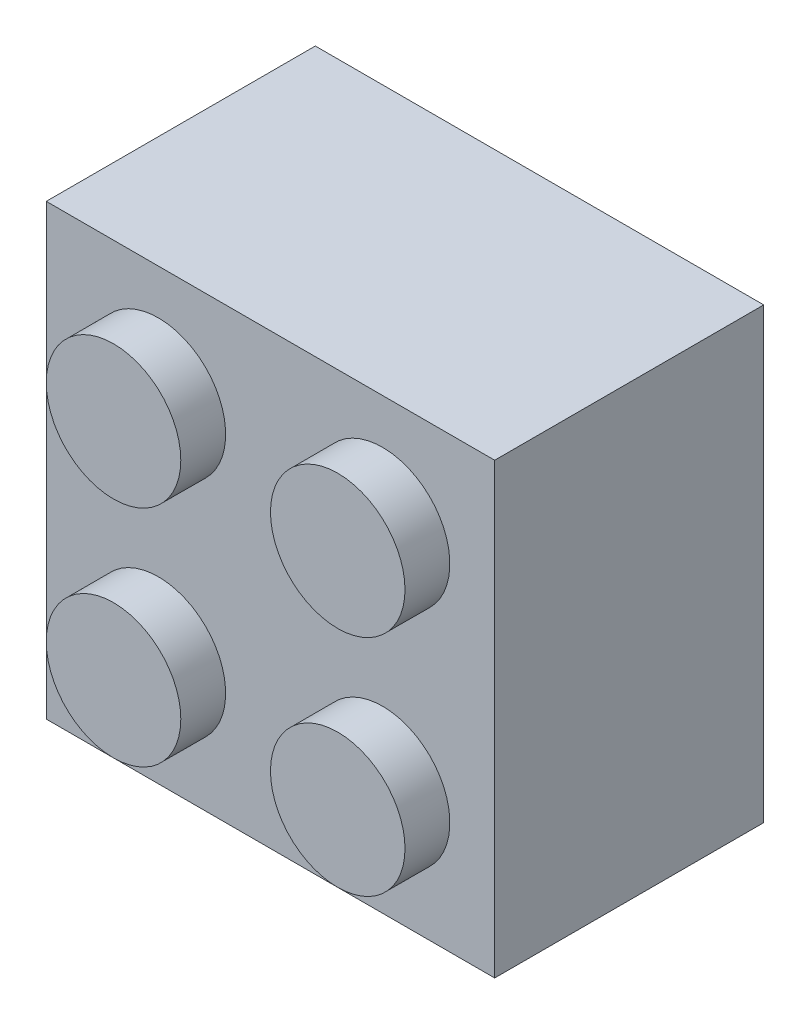
ISO-10303-21;
HEADER;
FILE_DESCRIPTION(('STEP AP214'),'2;1');
FILE_NAME('part.step','',(''),(''),'','','');
FILE_SCHEMA(('AUTOMOTIVE_DESIGN { 1 0 10303 214 1 1 1 1 }'));
ENDSEC;
DATA;
#1=APPLICATION_CONTEXT('core data for automotive mechanical design processes');
#2=APPLICATION_PROTOCOL_DEFINITION('international standard','automotive_design',2000,#1);
#3=PRODUCT_CONTEXT('',#1,'mechanical');
#4=PRODUCT('Part','Part','',(#3));
#5=PRODUCT_RELATED_PRODUCT_CATEGORY('part','',(#4));
#6=PRODUCT_DEFINITION_FORMATION('','',#4);
#7=PRODUCT_DEFINITION_CONTEXT('part definition',#1,'design');
#8=PRODUCT_DEFINITION('design','',#6,#7);
#9=PRODUCT_DEFINITION_SHAPE('','',#8);
#10=(LENGTH_UNIT() NAMED_UNIT(*) SI_UNIT(.MILLI.,.METRE.));
#11=(NAMED_UNIT(*) PLANE_ANGLE_UNIT() SI_UNIT($,.RADIAN.));
#12=(NAMED_UNIT(*) SI_UNIT($,.STERADIAN.) SOLID_ANGLE_UNIT());
#13=UNCERTAINTY_MEASURE_WITH_UNIT(LENGTH_MEASURE(1.E-05),#10,'distance_accuracy_value','');
#14=(GEOMETRIC_REPRESENTATION_CONTEXT(3) GLOBAL_UNCERTAINTY_ASSIGNED_CONTEXT((#13)) GLOBAL_UNIT_ASSIGNED_CONTEXT((#10,
#11,#12)) REPRESENTATION_CONTEXT('',''));
#15=CARTESIAN_POINT('',(0.,0.,0.));
#16=DIRECTION('',(0.,0.,1.));
#17=DIRECTION('',(1.,0.,0.));
#18=AXIS2_PLACEMENT_3D('',#15,#16,#17);
#19=CARTESIAN_POINT('',(0.,0.,7.9375));
#20=DIRECTION('',(0.,0.,-1.));
#21=DIRECTION('',(-1.,0.,0.));
#22=AXIS2_PLACEMENT_3D('',#19,#20,#21);
#23=PLANE('',#22);
#24=CARTESIAN_POINT('',(3.96875,11.90625,7.9375));
#25=DIRECTION('',(0.,0.,-1.));
#26=DIRECTION('',(-1.,0.,0.));
#27=AXIS2_PLACEMENT_3D('',#24,#25,#26);
#28=CIRCLE('',#27,0.79375);
#29=CARTESIAN_POINT('',(3.175,11.90625,7.9375));
#30=VERTEX_POINT('',#29);
#31=EDGE_CURVE('E138',#30,#30,#28,.F.);
#32=ORIENTED_EDGE('',*,*,#31,.T.);
#33=EDGE_LOOP('',(#32));
#34=FACE_BOUND('',#33,.T.);
#35=DIRECTION('',(0.,-1.,0.));
#36=VECTOR('',#35,1.);
#37=CARTESIAN_POINT('',(1.5875,0.,7.9375));
#38=LINE('',#37,#36);
#39=CARTESIAN_POINT('',(1.5875,14.2875,7.9375));
#40=VERTEX_POINT('',#39);
#41=CARTESIAN_POINT('',(1.5875,1.5875,7.9375));
#42=VERTEX_POINT('',#41);
#43=EDGE_CURVE('E120',#40,#42,#38,.T.);
#44=ORIENTED_EDGE('',*,*,#43,.F.);
#45=DIRECTION('',(-1.,0.,0.));
#46=VECTOR('',#45,1.);
#47=CARTESIAN_POINT('',(0.,14.2875,7.9375));
#48=LINE('',#47,#46);
#49=CARTESIAN_POINT('',(14.2875,14.2875,7.9375));
#50=VERTEX_POINT('',#49);
#51=EDGE_CURVE('E128',#50,#40,#48,.T.);
#52=ORIENTED_EDGE('',*,*,#51,.F.);
#53=DIRECTION('',(0.,1.,0.));
#54=VECTOR('',#53,1.);
#55=CARTESIAN_POINT('',(14.2875,0.,7.9375));
#56=LINE('',#55,#54);
#57=CARTESIAN_POINT('',(14.2875,1.5875,7.9375));
#58=VERTEX_POINT('',#57);
#59=EDGE_CURVE('E119',#58,#50,#56,.T.);
#60=ORIENTED_EDGE('',*,*,#59,.F.);
#61=DIRECTION('',(1.,0.,0.));
#62=VECTOR('',#61,1.);
#63=CARTESIAN_POINT('',(0.,1.5875,7.9375));
#64=LINE('',#63,#62);
#65=EDGE_CURVE('E109',#42,#58,#64,.T.);
#66=ORIENTED_EDGE('',*,*,#65,.F.);
#67=EDGE_LOOP('',(#44,#52,#60,#66));
#68=FACE_BOUND('',#67,.T.);
#69=CARTESIAN_POINT('',(3.96875,3.96875,7.9375));
#70=DIRECTION('',(0.,0.,-1.));
#71=DIRECTION('',(-1.,0.,0.));
#72=AXIS2_PLACEMENT_3D('',#69,#70,#71);
#73=CIRCLE('',#72,0.79375);
#74=CARTESIAN_POINT('',(3.175,3.96875,7.9375));
#75=VERTEX_POINT('',#74);
#76=EDGE_CURVE('E134',#75,#75,#73,.F.);
#77=ORIENTED_EDGE('',*,*,#76,.T.);
#78=EDGE_LOOP('',(#77));
#79=FACE_BOUND('',#78,.T.);
#80=CARTESIAN_POINT('',(11.90625,11.90625,7.9375));
#81=DIRECTION('',(0.,0.,-1.));
#82=DIRECTION('',(-1.,0.,0.));
#83=AXIS2_PLACEMENT_3D('',#80,#81,#82);
#84=CIRCLE('',#83,0.79375);
#85=CARTESIAN_POINT('',(11.1125,11.90625,7.9375));
#86=VERTEX_POINT('',#85);
#87=EDGE_CURVE('E137',#86,#86,#84,.F.);
#88=ORIENTED_EDGE('',*,*,#87,.T.);
#89=EDGE_LOOP('',(#88));
#90=FACE_BOUND('',#89,.T.);
#91=CARTESIAN_POINT('',(11.90625,3.96875,7.9375));
#92=DIRECTION('',(0.,0.,-1.));
#93=DIRECTION('',(-1.,0.,0.));
#94=AXIS2_PLACEMENT_3D('',#91,#92,#93);
#95=CIRCLE('',#94,0.79375);
#96=CARTESIAN_POINT('',(11.1125,3.96875,7.9375));
#97=VERTEX_POINT('',#96);
#98=EDGE_CURVE('E142',#97,#97,#95,.F.);
#99=ORIENTED_EDGE('',*,*,#98,.T.);
#100=EDGE_LOOP('',(#99));
#101=FACE_BOUND('',#100,.T.);
#102=CARTESIAN_POINT('',(7.9375,7.9375,7.9375));
#103=DIRECTION('',(0.,0.,-1.));
#104=DIRECTION('',(-1.,0.,0.));
#105=AXIS2_PLACEMENT_3D('',#102,#103,#104);
#106=CIRCLE('',#105,3.175);
#107=CARTESIAN_POINT('',(4.7625,7.9375,7.9375));
#108=VERTEX_POINT('',#107);
#109=EDGE_CURVE('E280',#108,#108,#106,.T.);
#110=ORIENTED_EDGE('',*,*,#109,.F.);
#111=EDGE_LOOP('',(#110));
#112=FACE_BOUND('',#111,.T.);
#113=ADVANCED_FACE('F34',(#34,#68,#79,#90,#101,#112),#23,.T.);
#114=CARTESIAN_POINT('',(0.,0.,0.));
#115=DIRECTION('',(0.,0.,-1.));
#116=DIRECTION('',(-1.,0.,0.));
#117=AXIS2_PLACEMENT_3D('',#114,#115,#116);
#118=PLANE('',#117);
#119=DIRECTION('',(0.,-1.,0.));
#120=VECTOR('',#119,1.);
#121=CARTESIAN_POINT('',(0.,0.,0.));
#122=LINE('',#121,#120);
#123=CARTESIAN_POINT('',(0.,15.875,0.));
#124=VERTEX_POINT('',#123);
#125=CARTESIAN_POINT('',(0.,0.,0.));
#126=VERTEX_POINT('',#125);
#127=EDGE_CURVE('E175',#124,#126,#122,.T.);
#128=ORIENTED_EDGE('',*,*,#127,.F.);
#129=DIRECTION('',(-1.,0.,0.));
#130=VECTOR('',#129,1.);
#131=CARTESIAN_POINT('',(0.,15.875,0.));
#132=LINE('',#131,#130);
#133=CARTESIAN_POINT('',(15.875,15.875,0.));
#134=VERTEX_POINT('',#133);
#135=EDGE_CURVE('E79',#134,#124,#132,.T.);
#136=ORIENTED_EDGE('',*,*,#135,.F.);
#137=DIRECTION('',(0.,1.,0.));
#138=VECTOR('',#137,1.);
#139=CARTESIAN_POINT('',(15.875,0.,0.));
#140=LINE('',#139,#138);
#141=CARTESIAN_POINT('',(15.875,0.,0.));
#142=VERTEX_POINT('',#141);
#143=EDGE_CURVE('E187',#142,#134,#140,.T.);
#144=ORIENTED_EDGE('',*,*,#143,.F.);
#145=DIRECTION('',(1.,0.,0.));
#146=VECTOR('',#145,1.);
#147=CARTESIAN_POINT('',(0.,0.,0.));
#148=LINE('',#147,#146);
#149=EDGE_CURVE('E185',#126,#142,#148,.T.);
#150=ORIENTED_EDGE('',*,*,#149,.F.);
#151=EDGE_LOOP('',(#128,#136,#144,#150));
#152=FACE_BOUND('',#151,.T.);
#153=DIRECTION('',(-1.,0.,0.));
#154=VECTOR('',#153,1.);
#155=CARTESIAN_POINT('',(0.,14.2875,0.));
#156=LINE('',#155,#154);
#157=CARTESIAN_POINT('',(14.2875,14.2875,0.));
#158=VERTEX_POINT('',#157);
#159=CARTESIAN_POINT('',(1.5875,14.2875,0.));
#160=VERTEX_POINT('',#159);
#161=EDGE_CURVE('E165',#158,#160,#156,.T.);
#162=ORIENTED_EDGE('',*,*,#161,.T.);
#163=DIRECTION('',(0.,-1.,0.));
#164=VECTOR('',#163,1.);
#165=CARTESIAN_POINT('',(1.5875,0.,0.));
#166=LINE('',#165,#164);
#167=CARTESIAN_POINT('',(1.5875,1.5875,0.));
#168=VERTEX_POINT('',#167);
#169=EDGE_CURVE('E152',#160,#168,#166,.T.);
#170=ORIENTED_EDGE('',*,*,#169,.T.);
#171=DIRECTION('',(1.,0.,0.));
#172=VECTOR('',#171,1.);
#173=CARTESIAN_POINT('',(0.,1.5875,0.));
#174=LINE('',#173,#172);
#175=CARTESIAN_POINT('',(14.2875,1.5875,0.));
#176=VERTEX_POINT('',#175);
#177=EDGE_CURVE('E164',#168,#176,#174,.T.);
#178=ORIENTED_EDGE('',*,*,#177,.T.);
#179=DIRECTION('',(0.,1.,0.));
#180=VECTOR('',#179,1.);
#181=CARTESIAN_POINT('',(14.2875,0.,0.));
#182=LINE('',#181,#180);
#183=EDGE_CURVE('E49',#176,#158,#182,.T.);
#184=ORIENTED_EDGE('',*,*,#183,.T.);
#185=EDGE_LOOP('',(#162,#170,#178,#184));
#186=FACE_BOUND('',#185,.T.);
#187=ADVANCED_FACE('F225',(#152,#186),#118,.T.);
#188=CARTESIAN_POINT('',(0.,0.,9.525));
#189=DIRECTION('',(0.,0.,-1.));
#190=DIRECTION('',(-1.,0.,0.));
#191=AXIS2_PLACEMENT_3D('',#188,#189,#190);
#192=PLANE('',#191);
#193=CARTESIAN_POINT('',(3.96875,11.90625,9.525));
#194=DIRECTION('',(0.,0.,-1.));
#195=DIRECTION('',(-1.,0.,0.));
#196=AXIS2_PLACEMENT_3D('',#193,#194,#195);
#197=CIRCLE('',#196,2.38125);
#198=CARTESIAN_POINT('',(1.5875,11.90625,9.525));
#199=VERTEX_POINT('',#198);
#200=EDGE_CURVE('E198',#199,#199,#197,.F.);
#201=ORIENTED_EDGE('',*,*,#200,.F.);
#202=EDGE_LOOP('',(#201));
#203=FACE_BOUND('',#202,.T.);
#204=DIRECTION('',(0.,-1.,0.));
#205=VECTOR('',#204,1.);
#206=CARTESIAN_POINT('',(0.,0.,9.525));
#207=LINE('',#206,#205);
#208=CARTESIAN_POINT('',(0.,15.875,9.525));
#209=VERTEX_POINT('',#208);
#210=CARTESIAN_POINT('',(0.,0.,9.525));
#211=VERTEX_POINT('',#210);
#212=EDGE_CURVE('E176',#209,#211,#207,.T.);
#213=ORIENTED_EDGE('',*,*,#212,.T.);
#214=DIRECTION('',(1.,0.,0.));
#215=VECTOR('',#214,1.);
#216=CARTESIAN_POINT('',(0.,0.,9.525));
#217=LINE('',#216,#215);
#218=CARTESIAN_POINT('',(15.875,0.,9.525));
#219=VERTEX_POINT('',#218);
#220=EDGE_CURVE('E87',#211,#219,#217,.T.);
#221=ORIENTED_EDGE('',*,*,#220,.T.);
#222=DIRECTION('',(0.,1.,0.));
#223=VECTOR('',#222,1.);
#224=CARTESIAN_POINT('',(15.875,0.,9.525));
#225=LINE('',#224,#223);
#226=CARTESIAN_POINT('',(15.875,15.875,9.525));
#227=VERTEX_POINT('',#226);
#228=EDGE_CURVE('E179',#219,#227,#225,.T.);
#229=ORIENTED_EDGE('',*,*,#228,.T.);
#230=DIRECTION('',(-1.,0.,0.));
#231=VECTOR('',#230,1.);
#232=CARTESIAN_POINT('',(0.,15.875,9.525));
#233=LINE('',#232,#231);
#234=EDGE_CURVE('E58',#227,#209,#233,.T.);
#235=ORIENTED_EDGE('',*,*,#234,.T.);
#236=EDGE_LOOP('',(#213,#221,#229,#235));
#237=FACE_BOUND('',#236,.T.);
#238=CARTESIAN_POINT('',(3.96875,3.96875,9.525));
#239=DIRECTION('',(0.,0.,-1.));
#240=DIRECTION('',(-1.,0.,0.));
#241=AXIS2_PLACEMENT_3D('',#238,#239,#240);
#242=CIRCLE('',#241,2.38125);
#243=CARTESIAN_POINT('',(1.5875,3.96875,9.525));
#244=VERTEX_POINT('',#243);
#245=EDGE_CURVE('E201',#244,#244,#242,.F.);
#246=ORIENTED_EDGE('',*,*,#245,.F.);
#247=EDGE_LOOP('',(#246));
#248=FACE_BOUND('',#247,.T.);
#249=CARTESIAN_POINT('',(11.90625,11.90625,9.525));
#250=DIRECTION('',(0.,0.,-1.));
#251=DIRECTION('',(-1.,0.,0.));
#252=AXIS2_PLACEMENT_3D('',#249,#250,#251);
#253=CIRCLE('',#252,2.38125);
#254=CARTESIAN_POINT('',(9.525,11.90625,9.525));
#255=VERTEX_POINT('',#254);
#256=EDGE_CURVE('E204',#255,#255,#253,.F.);
#257=ORIENTED_EDGE('',*,*,#256,.F.);
#258=EDGE_LOOP('',(#257));
#259=FACE_BOUND('',#258,.T.);
#260=CARTESIAN_POINT('',(11.90625,3.96875,9.525));
#261=DIRECTION('',(0.,0.,-1.));
#262=DIRECTION('',(-1.,0.,0.));
#263=AXIS2_PLACEMENT_3D('',#260,#261,#262);
#264=CIRCLE('',#263,2.38125);
#265=CARTESIAN_POINT('',(9.525,3.96875,9.525));
#266=VERTEX_POINT('',#265);
#267=EDGE_CURVE('E210',#266,#266,#264,.F.);
#268=ORIENTED_EDGE('',*,*,#267,.F.);
#269=EDGE_LOOP('',(#268));
#270=FACE_BOUND('',#269,.T.);
#271=ADVANCED_FACE('F222',(#203,#237,#248,#259,#270),#192,.F.);
#272=CARTESIAN_POINT('',(0.,0.,9.525));
#273=DIRECTION('',(1.,0.,0.));
#274=DIRECTION('',(0.,0.,-1.));
#275=AXIS2_PLACEMENT_3D('',#272,#273,#274);
#276=PLANE('',#275);
#277=ORIENTED_EDGE('',*,*,#127,.T.);
#278=DIRECTION('',(0.,0.,-1.));
#279=VECTOR('',#278,1.);
#280=CARTESIAN_POINT('',(0.,0.,9.525));
#281=LINE('',#280,#279);
#282=EDGE_CURVE('E196',#211,#126,#281,.T.);
#283=ORIENTED_EDGE('',*,*,#282,.F.);
#284=ORIENTED_EDGE('',*,*,#212,.F.);
#285=DIRECTION('',(0.,0.,-1.));
#286=VECTOR('',#285,1.);
#287=CARTESIAN_POINT('',(0.,15.875,9.525));
#288=LINE('',#287,#286);
#289=EDGE_CURVE('E182',#209,#124,#288,.T.);
#290=ORIENTED_EDGE('',*,*,#289,.T.);
#291=EDGE_LOOP('',(#277,#283,#284,#290));
#292=FACE_BOUND('',#291,.T.);
#293=ADVANCED_FACE('F224',(#292),#276,.F.);
#294=CARTESIAN_POINT('',(0.,0.,9.525));
#295=DIRECTION('',(0.,1.,0.));
#296=DIRECTION('',(0.,0.,1.));
#297=AXIS2_PLACEMENT_3D('',#294,#295,#296);
#298=PLANE('',#297);
#299=ORIENTED_EDGE('',*,*,#149,.T.);
#300=DIRECTION('',(0.,0.,-1.));
#301=VECTOR('',#300,1.);
#302=CARTESIAN_POINT('',(15.875,0.,9.525));
#303=LINE('',#302,#301);
#304=EDGE_CURVE('E193',#219,#142,#303,.T.);
#305=ORIENTED_EDGE('',*,*,#304,.F.);
#306=ORIENTED_EDGE('',*,*,#220,.F.);
#307=ORIENTED_EDGE('',*,*,#282,.T.);
#308=EDGE_LOOP('',(#299,#305,#306,#307));
#309=FACE_BOUND('',#308,.T.);
#310=ADVANCED_FACE('F232',(#309),#298,.F.);
#311=CARTESIAN_POINT('',(15.875,0.,9.525));
#312=DIRECTION('',(-1.,0.,0.));
#313=DIRECTION('',(0.,0.,1.));
#314=AXIS2_PLACEMENT_3D('',#311,#312,#313);
#315=PLANE('',#314);
#316=ORIENTED_EDGE('',*,*,#143,.T.);
#317=DIRECTION('',(0.,0.,-1.));
#318=VECTOR('',#317,1.);
#319=CARTESIAN_POINT('',(15.875,15.875,9.525));
#320=LINE('',#319,#318);
#321=EDGE_CURVE('E191',#227,#134,#320,.T.);
#322=ORIENTED_EDGE('',*,*,#321,.F.);
#323=ORIENTED_EDGE('',*,*,#228,.F.);
#324=ORIENTED_EDGE('',*,*,#304,.T.);
#325=EDGE_LOOP('',(#316,#322,#323,#324));
#326=FACE_BOUND('',#325,.T.);
#327=ADVANCED_FACE('F347',(#326),#315,.F.);
#328=CARTESIAN_POINT('',(0.,15.875,9.525));
#329=DIRECTION('',(0.,-1.,0.));
#330=DIRECTION('',(0.,0.,-1.));
#331=AXIS2_PLACEMENT_3D('',#328,#329,#330);
#332=PLANE('',#331);
#333=ORIENTED_EDGE('',*,*,#135,.T.);
#334=ORIENTED_EDGE('',*,*,#289,.F.);
#335=ORIENTED_EDGE('',*,*,#234,.F.);
#336=ORIENTED_EDGE('',*,*,#321,.T.);
#337=EDGE_LOOP('',(#333,#334,#335,#336));
#338=FACE_BOUND('',#337,.T.);
#339=ADVANCED_FACE('F342',(#338),#332,.F.);
#340=CARTESIAN_POINT('',(3.96875,11.90625,11.1125));
#341=DIRECTION('',(0.,0.,-1.));
#342=DIRECTION('',(-1.,0.,0.));
#343=AXIS2_PLACEMENT_3D('',#340,#341,#342);
#344=CYLINDRICAL_SURFACE('',#343,2.38125);
#345=CARTESIAN_POINT('',(3.96875,11.90625,11.1125));
#346=DIRECTION('',(0.,0.,1.));
#347=DIRECTION('',(1.,0.,0.));
#348=AXIS2_PLACEMENT_3D('',#345,#346,#347);
#349=CIRCLE('',#348,2.38125);
#350=CARTESIAN_POINT('',(6.35,11.90625,11.1125));
#351=VERTEX_POINT('',#350);
#352=EDGE_CURVE('E172',#351,#351,#349,.T.);
#353=ORIENTED_EDGE('',*,*,#352,.F.);
#354=EDGE_LOOP('',(#353));
#355=FACE_BOUND('',#354,.T.);
#356=ORIENTED_EDGE('',*,*,#200,.T.);
#357=EDGE_LOOP('',(#356));
#358=FACE_BOUND('',#357,.T.);
#359=ADVANCED_FACE('F339',(#355,#358),#344,.T.);
#360=CARTESIAN_POINT('',(3.96875,11.90625,11.1125));
#361=DIRECTION('',(0.,0.,1.));
#362=DIRECTION('',(1.,0.,0.));
#363=AXIS2_PLACEMENT_3D('',#360,#361,#362);
#364=PLANE('',#363);
#365=ORIENTED_EDGE('',*,*,#352,.T.);
#366=EDGE_LOOP('',(#365));
#367=FACE_BOUND('',#366,.T.);
#368=ADVANCED_FACE('F336',(#367),#364,.T.);
#369=CARTESIAN_POINT('',(3.96875,3.96875,11.1125));
#370=DIRECTION('',(0.,0.,-1.));
#371=DIRECTION('',(-1.,0.,0.));
#372=AXIS2_PLACEMENT_3D('',#369,#370,#371);
#373=CYLINDRICAL_SURFACE('',#372,2.38125);
#374=CARTESIAN_POINT('',(3.96875,3.96875,11.1125));
#375=DIRECTION('',(0.,0.,1.));
#376=DIRECTION('',(1.,0.,0.));
#377=AXIS2_PLACEMENT_3D('',#374,#375,#376);
#378=CIRCLE('',#377,2.38125);
#379=CARTESIAN_POINT('',(6.35,3.96875,11.1125));
#380=VERTEX_POINT('',#379);
#381=EDGE_CURVE('E161',#380,#380,#378,.T.);
#382=ORIENTED_EDGE('',*,*,#381,.F.);
#383=EDGE_LOOP('',(#382));
#384=FACE_BOUND('',#383,.T.);
#385=ORIENTED_EDGE('',*,*,#245,.T.);
#386=EDGE_LOOP('',(#385));
#387=FACE_BOUND('',#386,.T.);
#388=ADVANCED_FACE('F332',(#384,#387),#373,.T.);
#389=CARTESIAN_POINT('',(3.96875,3.96875,11.1125));
#390=DIRECTION('',(0.,0.,1.));
#391=DIRECTION('',(1.,0.,0.));
#392=AXIS2_PLACEMENT_3D('',#389,#390,#391);
#393=PLANE('',#392);
#394=ORIENTED_EDGE('',*,*,#381,.T.);
#395=EDGE_LOOP('',(#394));
#396=FACE_BOUND('',#395,.T.);
#397=ADVANCED_FACE('F328',(#396),#393,.T.);
#398=CARTESIAN_POINT('',(11.90625,11.90625,11.1125));
#399=DIRECTION('',(0.,0.,1.));
#400=DIRECTION('',(1.,0.,0.));
#401=AXIS2_PLACEMENT_3D('',#398,#399,#400);
#402=PLANE('',#401);
#403=CARTESIAN_POINT('',(11.90625,11.90625,11.1125));
#404=DIRECTION('',(0.,0.,1.));
#405=DIRECTION('',(1.,0.,0.));
#406=AXIS2_PLACEMENT_3D('',#403,#404,#405);
#407=CIRCLE('',#406,2.38125);
#408=CARTESIAN_POINT('',(14.2875,11.90625,11.1125));
#409=VERTEX_POINT('',#408);
#410=EDGE_CURVE('E207',#409,#409,#407,.T.);
#411=ORIENTED_EDGE('',*,*,#410,.T.);
#412=EDGE_LOOP('',(#411));
#413=FACE_BOUND('',#412,.T.);
#414=ADVANCED_FACE('F331',(#413),#402,.T.);
#415=CARTESIAN_POINT('',(11.90625,11.90625,11.1125));
#416=DIRECTION('',(0.,0.,-1.));
#417=DIRECTION('',(-1.,0.,0.));
#418=AXIS2_PLACEMENT_3D('',#415,#416,#417);
#419=CYLINDRICAL_SURFACE('',#418,2.38125);
#420=ORIENTED_EDGE('',*,*,#410,.F.);
#421=EDGE_LOOP('',(#420));
#422=FACE_BOUND('',#421,.T.);
#423=ORIENTED_EDGE('',*,*,#256,.T.);
#424=EDGE_LOOP('',(#423));
#425=FACE_BOUND('',#424,.T.);
#426=ADVANCED_FACE('F359',(#422,#425),#419,.T.);
#427=CARTESIAN_POINT('',(11.90625,3.96875,11.1125));
#428=DIRECTION('',(0.,0.,1.));
#429=DIRECTION('',(1.,0.,0.));
#430=AXIS2_PLACEMENT_3D('',#427,#428,#429);
#431=PLANE('',#430);
#432=CARTESIAN_POINT('',(11.90625,3.96875,11.1125));
#433=DIRECTION('',(0.,0.,1.));
#434=DIRECTION('',(1.,0.,0.));
#435=AXIS2_PLACEMENT_3D('',#432,#433,#434);
#436=CIRCLE('',#435,2.38125);
#437=CARTESIAN_POINT('',(14.2875,3.96875,11.1125));
#438=VERTEX_POINT('',#437);
#439=EDGE_CURVE('E42',#438,#438,#436,.T.);
#440=ORIENTED_EDGE('',*,*,#439,.T.);
#441=EDGE_LOOP('',(#440));
#442=FACE_BOUND('',#441,.T.);
#443=ADVANCED_FACE('F36',(#442),#431,.T.);
#444=CARTESIAN_POINT('',(11.90625,3.96875,11.1125));
#445=DIRECTION('',(0.,0.,-1.));
#446=DIRECTION('',(-1.,0.,0.));
#447=AXIS2_PLACEMENT_3D('',#444,#445,#446);
#448=CYLINDRICAL_SURFACE('',#447,2.38125);
#449=ORIENTED_EDGE('',*,*,#439,.F.);
#450=EDGE_LOOP('',(#449));
#451=FACE_BOUND('',#450,.T.);
#452=ORIENTED_EDGE('',*,*,#267,.T.);
#453=EDGE_LOOP('',(#452));
#454=FACE_BOUND('',#453,.T.);
#455=ADVANCED_FACE('F216',(#451,#454),#448,.T.);
#456=CARTESIAN_POINT('',(1.5875,0.,9.525));
#457=DIRECTION('',(1.,0.,0.));
#458=DIRECTION('',(0.,0.,-1.));
#459=AXIS2_PLACEMENT_3D('',#456,#457,#458);
#460=PLANE('',#459);
#461=ORIENTED_EDGE('',*,*,#169,.F.);
#462=DIRECTION('',(0.,0.,-1.));
#463=VECTOR('',#462,1.);
#464=CARTESIAN_POINT('',(1.5875,14.2875,9.525));
#465=LINE('',#464,#463);
#466=EDGE_CURVE('E130',#40,#160,#465,.T.);
#467=ORIENTED_EDGE('',*,*,#466,.F.);
#468=ORIENTED_EDGE('',*,*,#43,.T.);
#469=DIRECTION('',(0.,0.,-1.));
#470=VECTOR('',#469,1.);
#471=CARTESIAN_POINT('',(1.5875,1.5875,9.525));
#472=LINE('',#471,#470);
#473=EDGE_CURVE('E114',#42,#168,#472,.T.);
#474=ORIENTED_EDGE('',*,*,#473,.T.);
#475=EDGE_LOOP('',(#461,#467,#468,#474));
#476=FACE_BOUND('',#475,.T.);
#477=ADVANCED_FACE('F219',(#476),#460,.T.);
#478=CARTESIAN_POINT('',(0.,1.5875,9.525));
#479=DIRECTION('',(0.,1.,0.));
#480=DIRECTION('',(0.,0.,1.));
#481=AXIS2_PLACEMENT_3D('',#478,#479,#480);
#482=PLANE('',#481);
#483=ORIENTED_EDGE('',*,*,#177,.F.);
#484=ORIENTED_EDGE('',*,*,#473,.F.);
#485=ORIENTED_EDGE('',*,*,#65,.T.);
#486=DIRECTION('',(0.,0.,-1.));
#487=VECTOR('',#486,1.);
#488=CARTESIAN_POINT('',(14.2875,1.5875,9.525));
#489=LINE('',#488,#487);
#490=EDGE_CURVE('E111',#58,#176,#489,.T.);
#491=ORIENTED_EDGE('',*,*,#490,.T.);
#492=EDGE_LOOP('',(#483,#484,#485,#491));
#493=FACE_BOUND('',#492,.T.);
#494=ADVANCED_FACE('F110',(#493),#482,.T.);
#495=CARTESIAN_POINT('',(14.2875,0.,9.525));
#496=DIRECTION('',(-1.,0.,0.));
#497=DIRECTION('',(0.,0.,1.));
#498=AXIS2_PLACEMENT_3D('',#495,#496,#497);
#499=PLANE('',#498);
#500=ORIENTED_EDGE('',*,*,#183,.F.);
#501=ORIENTED_EDGE('',*,*,#490,.F.);
#502=ORIENTED_EDGE('',*,*,#59,.T.);
#503=DIRECTION('',(0.,0.,-1.));
#504=VECTOR('',#503,1.);
#505=CARTESIAN_POINT('',(14.2875,14.2875,9.525));
#506=LINE('',#505,#504);
#507=EDGE_CURVE('E124',#50,#158,#506,.T.);
#508=ORIENTED_EDGE('',*,*,#507,.T.);
#509=EDGE_LOOP('',(#500,#501,#502,#508));
#510=FACE_BOUND('',#509,.T.);
#511=ADVANCED_FACE('F122',(#510),#499,.T.);
#512=CARTESIAN_POINT('',(0.,14.2875,9.525));
#513=DIRECTION('',(0.,-1.,0.));
#514=DIRECTION('',(0.,0.,-1.));
#515=AXIS2_PLACEMENT_3D('',#512,#513,#514);
#516=PLANE('',#515);
#517=ORIENTED_EDGE('',*,*,#161,.F.);
#518=ORIENTED_EDGE('',*,*,#507,.F.);
#519=ORIENTED_EDGE('',*,*,#51,.T.);
#520=ORIENTED_EDGE('',*,*,#466,.T.);
#521=EDGE_LOOP('',(#517,#518,#519,#520));
#522=FACE_BOUND('',#521,.T.);
#523=ADVANCED_FACE('F291',(#522),#516,.T.);
#524=CARTESIAN_POINT('',(3.96875,11.90625,11.1125));
#525=DIRECTION('',(0.,0.,-1.));
#526=DIRECTION('',(-1.,0.,0.));
#527=AXIS2_PLACEMENT_3D('',#524,#525,#526);
#528=CYLINDRICAL_SURFACE('',#527,0.79375);
#529=CARTESIAN_POINT('',(3.96875,11.90625,9.525));
#530=DIRECTION('',(0.,0.,1.));
#531=DIRECTION('',(1.,0.,0.));
#532=AXIS2_PLACEMENT_3D('',#529,#530,#531);
#533=CIRCLE('',#532,0.79375);
#534=CARTESIAN_POINT('',(4.7625,11.90625,9.525));
#535=VERTEX_POINT('',#534);
#536=EDGE_CURVE('E149',#535,#535,#533,.T.);
#537=ORIENTED_EDGE('',*,*,#536,.T.);
#538=EDGE_LOOP('',(#537));
#539=FACE_BOUND('',#538,.T.);
#540=ORIENTED_EDGE('',*,*,#31,.F.);
#541=EDGE_LOOP('',(#540));
#542=FACE_BOUND('',#541,.T.);
#543=ADVANCED_FACE('F294',(#539,#542),#528,.F.);
#544=CARTESIAN_POINT('',(3.96875,11.90625,9.525));
#545=DIRECTION('',(0.,0.,1.));
#546=DIRECTION('',(1.,0.,0.));
#547=AXIS2_PLACEMENT_3D('',#544,#545,#546);
#548=PLANE('',#547);
#549=ORIENTED_EDGE('',*,*,#536,.F.);
#550=EDGE_LOOP('',(#549));
#551=FACE_BOUND('',#550,.T.);
#552=ADVANCED_FACE('F300',(#551),#548,.F.);
#553=CARTESIAN_POINT('',(3.96875,3.96875,11.1125));
#554=DIRECTION('',(0.,0.,-1.));
#555=DIRECTION('',(-1.,0.,0.));
#556=AXIS2_PLACEMENT_3D('',#553,#554,#555);
#557=CYLINDRICAL_SURFACE('',#556,0.79375);
#558=CARTESIAN_POINT('',(3.96875,3.96875,9.525));
#559=DIRECTION('',(0.,0.,1.));
#560=DIRECTION('',(1.,0.,0.));
#561=AXIS2_PLACEMENT_3D('',#558,#559,#560);
#562=CIRCLE('',#561,0.79375);
#563=CARTESIAN_POINT('',(4.7625,3.96875,9.525));
#564=VERTEX_POINT('',#563);
#565=EDGE_CURVE('E153',#564,#564,#562,.T.);
#566=ORIENTED_EDGE('',*,*,#565,.T.);
#567=EDGE_LOOP('',(#566));
#568=FACE_BOUND('',#567,.T.);
#569=ORIENTED_EDGE('',*,*,#76,.F.);
#570=EDGE_LOOP('',(#569));
#571=FACE_BOUND('',#570,.T.);
#572=ADVANCED_FACE('F308',(#568,#571),#557,.F.);
#573=CARTESIAN_POINT('',(3.96875,3.96875,9.525));
#574=DIRECTION('',(0.,0.,1.));
#575=DIRECTION('',(1.,0.,0.));
#576=AXIS2_PLACEMENT_3D('',#573,#574,#575);
#577=PLANE('',#576);
#578=ORIENTED_EDGE('',*,*,#565,.F.);
#579=EDGE_LOOP('',(#578));
#580=FACE_BOUND('',#579,.T.);
#581=ADVANCED_FACE('F312',(#580),#577,.F.);
#582=CARTESIAN_POINT('',(11.90625,11.90625,9.525));
#583=DIRECTION('',(0.,0.,1.));
#584=DIRECTION('',(1.,0.,0.));
#585=AXIS2_PLACEMENT_3D('',#582,#583,#584);
#586=PLANE('',#585);
#587=CARTESIAN_POINT('',(11.90625,11.90625,9.525));
#588=DIRECTION('',(0.,0.,1.));
#589=DIRECTION('',(1.,0.,0.));
#590=AXIS2_PLACEMENT_3D('',#587,#588,#589);
#591=CIRCLE('',#590,0.79375);
#592=CARTESIAN_POINT('',(12.7,11.90625,9.525));
#593=VERTEX_POINT('',#592);
#594=EDGE_CURVE('E141',#593,#593,#591,.T.);
#595=ORIENTED_EDGE('',*,*,#594,.F.);
#596=EDGE_LOOP('',(#595));
#597=FACE_BOUND('',#596,.T.);
#598=ADVANCED_FACE('F316',(#597),#586,.F.);
#599=CARTESIAN_POINT('',(11.90625,11.90625,11.1125));
#600=DIRECTION('',(0.,0.,-1.));
#601=DIRECTION('',(-1.,0.,0.));
#602=AXIS2_PLACEMENT_3D('',#599,#600,#601);
#603=CYLINDRICAL_SURFACE('',#602,0.79375);
#604=ORIENTED_EDGE('',*,*,#594,.T.);
#605=EDGE_LOOP('',(#604));
#606=FACE_BOUND('',#605,.T.);
#607=ORIENTED_EDGE('',*,*,#87,.F.);
#608=EDGE_LOOP('',(#607));
#609=FACE_BOUND('',#608,.T.);
#610=ADVANCED_FACE('F320',(#606,#609),#603,.F.);
#611=CARTESIAN_POINT('',(11.90625,3.96875,9.525));
#612=DIRECTION('',(0.,0.,1.));
#613=DIRECTION('',(1.,0.,0.));
#614=AXIS2_PLACEMENT_3D('',#611,#612,#613);
#615=PLANE('',#614);
#616=CARTESIAN_POINT('',(11.90625,3.96875,9.525));
#617=DIRECTION('',(0.,0.,1.));
#618=DIRECTION('',(1.,0.,0.));
#619=AXIS2_PLACEMENT_3D('',#616,#617,#618);
#620=CIRCLE('',#619,0.79375);
#621=CARTESIAN_POINT('',(12.7,3.96875,9.525));
#622=VERTEX_POINT('',#621);
#623=EDGE_CURVE('E145',#622,#622,#620,.T.);
#624=ORIENTED_EDGE('',*,*,#623,.F.);
#625=EDGE_LOOP('',(#624));
#626=FACE_BOUND('',#625,.T.);
#627=ADVANCED_FACE('F272',(#626),#615,.F.);
#628=CARTESIAN_POINT('',(11.90625,3.96875,11.1125));
#629=DIRECTION('',(0.,0.,-1.));
#630=DIRECTION('',(-1.,0.,0.));
#631=AXIS2_PLACEMENT_3D('',#628,#629,#630);
#632=CYLINDRICAL_SURFACE('',#631,0.79375);
#633=ORIENTED_EDGE('',*,*,#623,.T.);
#634=EDGE_LOOP('',(#633));
#635=FACE_BOUND('',#634,.T.);
#636=ORIENTED_EDGE('',*,*,#98,.F.);
#637=EDGE_LOOP('',(#636));
#638=FACE_BOUND('',#637,.T.);
#639=ADVANCED_FACE('F267',(#635,#638),#632,.F.);
#640=CARTESIAN_POINT('',(7.9375,7.9375,0.));
#641=DIRECTION('',(0.,0.,-1.));
#642=DIRECTION('',(-1.,0.,0.));
#643=AXIS2_PLACEMENT_3D('',#640,#641,#642);
#644=PLANE('',#643);
#645=CARTESIAN_POINT('',(7.9375,7.9375,0.));
#646=DIRECTION('',(0.,0.,-1.));
#647=DIRECTION('',(-1.,0.,0.));
#648=AXIS2_PLACEMENT_3D('',#645,#646,#647);
#649=CIRCLE('',#648,3.175);
#650=CARTESIAN_POINT('',(4.7625,7.9375,0.));
#651=VERTEX_POINT('',#650);
#652=EDGE_CURVE('E156',#651,#651,#649,.T.);
#653=ORIENTED_EDGE('',*,*,#652,.T.);
#654=EDGE_LOOP('',(#653));
#655=FACE_BOUND('',#654,.T.);
#656=CARTESIAN_POINT('',(7.9375,7.9375,0.));
#657=DIRECTION('',(0.,0.,-1.));
#658=DIRECTION('',(-1.,0.,0.));
#659=AXIS2_PLACEMENT_3D('',#656,#657,#658);
#660=CIRCLE('',#659,2.38125);
#661=CARTESIAN_POINT('',(5.55625,7.9375,0.));
#662=VERTEX_POINT('',#661);
#663=EDGE_CURVE('E279',#662,#662,#660,.T.);
#664=ORIENTED_EDGE('',*,*,#663,.F.);
#665=EDGE_LOOP('',(#664));
#666=FACE_BOUND('',#665,.T.);
#667=ADVANCED_FACE('F262',(#655,#666),#644,.T.);
#668=CARTESIAN_POINT('',(7.9375,7.9375,0.));
#669=DIRECTION('',(0.,0.,1.));
#670=DIRECTION('',(1.,0.,0.));
#671=AXIS2_PLACEMENT_3D('',#668,#669,#670);
#672=CYLINDRICAL_SURFACE('',#671,3.175);
#673=ORIENTED_EDGE('',*,*,#652,.F.);
#674=EDGE_LOOP('',(#673));
#675=FACE_BOUND('',#674,.T.);
#676=ORIENTED_EDGE('',*,*,#109,.T.);
#677=EDGE_LOOP('',(#676));
#678=FACE_BOUND('',#677,.T.);
#679=ADVANCED_FACE('F254',(#675,#678),#672,.T.);
#680=CARTESIAN_POINT('',(7.9375,7.9375,0.));
#681=DIRECTION('',(0.,0.,1.));
#682=DIRECTION('',(1.,0.,0.));
#683=AXIS2_PLACEMENT_3D('',#680,#681,#682);
#684=CYLINDRICAL_SURFACE('',#683,2.38125);
#685=ORIENTED_EDGE('',*,*,#663,.T.);
#686=EDGE_LOOP('',(#685));
#687=FACE_BOUND('',#686,.T.);
#688=CARTESIAN_POINT('',(7.9375,7.9375,7.9375));
#689=DIRECTION('',(0.,0.,-1.));
#690=DIRECTION('',(-1.,0.,0.));
#691=AXIS2_PLACEMENT_3D('',#688,#689,#690);
#692=CIRCLE('',#691,2.38125);
#693=CARTESIAN_POINT('',(5.55625,7.9375,7.9375));
#694=VERTEX_POINT('',#693);
#695=EDGE_CURVE('E11',#694,#694,#692,.F.);
#696=ORIENTED_EDGE('',*,*,#695,.T.);
#697=EDGE_LOOP('',(#696));
#698=FACE_BOUND('',#697,.T.);
#699=ADVANCED_FACE('F249',(#687,#698),#684,.F.);
#700=ORIENTED_EDGE('',*,*,#695,.F.);
#701=EDGE_LOOP('',(#700));
#702=FACE_BOUND('',#701,.T.);
#703=ADVANCED_FACE('F242',(#702),#23,.T.);
#704=CLOSED_SHELL('',(#113,#187,#271,#293,#310,#327,#339,#359,#368,#388,#397,#414,#426,#443,
#455,#477,#494,#511,#523,#543,#552,#572,#581,#598,#610,#627,#639,#667,#679,#699,#703));
#705=MANIFOLD_SOLID_BREP('B2',#704);
#706=ADVANCED_BREP_SHAPE_REPRESENTATION('',(#18,#705),#14);
#707=SHAPE_DEFINITION_REPRESENTATION(#9,#706);
ENDSEC;
END-ISO-10303-21;
